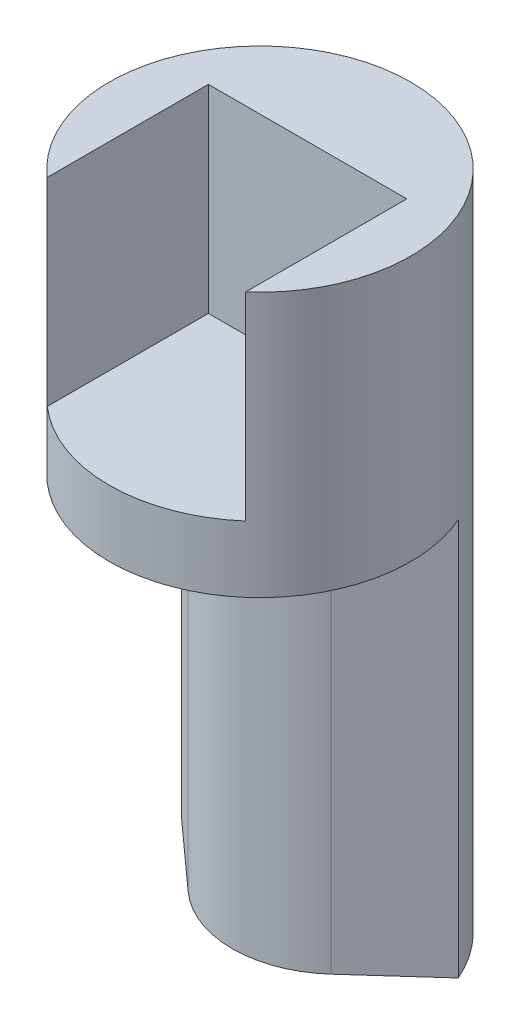
ISO-10303-21;
HEADER;
FILE_DESCRIPTION(('STEP AP214'),'2;1');
FILE_NAME('part.step','',(''),(''),'','','');
FILE_SCHEMA(('AUTOMOTIVE_DESIGN { 1 0 10303 214 1 1 1 1 }'));
ENDSEC;
DATA;
#1=APPLICATION_CONTEXT('core data for automotive mechanical design processes');
#2=APPLICATION_PROTOCOL_DEFINITION('international standard','automotive_design',2000,#1);
#3=PRODUCT_CONTEXT('',#1,'mechanical');
#4=PRODUCT('Part','Part','',(#3));
#5=PRODUCT_RELATED_PRODUCT_CATEGORY('part','',(#4));
#6=PRODUCT_DEFINITION_FORMATION('','',#4);
#7=PRODUCT_DEFINITION_CONTEXT('part definition',#1,'design');
#8=PRODUCT_DEFINITION('design','',#6,#7);
#9=PRODUCT_DEFINITION_SHAPE('','',#8);
#10=(LENGTH_UNIT() NAMED_UNIT(*) SI_UNIT(.MILLI.,.METRE.));
#11=(NAMED_UNIT(*) PLANE_ANGLE_UNIT() SI_UNIT($,.RADIAN.));
#12=(NAMED_UNIT(*) SI_UNIT($,.STERADIAN.) SOLID_ANGLE_UNIT());
#13=UNCERTAINTY_MEASURE_WITH_UNIT(LENGTH_MEASURE(1.E-05),#10,'distance_accuracy_value','');
#14=(GEOMETRIC_REPRESENTATION_CONTEXT(3) GLOBAL_UNCERTAINTY_ASSIGNED_CONTEXT((#13)) GLOBAL_UNIT_ASSIGNED_CONTEXT((#10,
#11,#12)) REPRESENTATION_CONTEXT('',''));
#15=CARTESIAN_POINT('',(0.,0.,0.));
#16=DIRECTION('',(0.,0.,1.));
#17=DIRECTION('',(1.,0.,0.));
#18=AXIS2_PLACEMENT_3D('',#15,#16,#17);
#19=CARTESIAN_POINT('',(11.8908364727638,50.8,-4.49590680157107));
#20=DIRECTION('',(0.66938331115646,0.,0.742917211232324));
#21=DIRECTION('',(0.742917211232324,0.,-0.66938331115646));
#22=AXIS2_PLACEMENT_3D('',#19,#20,#21);
#23=PLANE('',#22);
#24=DIRECTION('',(0.742917211232324,0.,-0.66938331115646));
#25=VECTOR('',#24,1.);
#26=CARTESIAN_POINT('',(3.09217667717952,38.1,3.43186218622486));
#27=LINE('',#26,#25);
#28=CARTESIAN_POINT('',(6.86894378576314,38.1,0.0289192547816858));
#29=VERTEX_POINT('',#28);
#30=CARTESIAN_POINT('',(13.2859442908798,38.1,-5.75292693327819));
#31=VERTEX_POINT('',#30);
#32=EDGE_CURVE('E141',#29,#31,#27,.T.);
#33=ORIENTED_EDGE('',*,*,#32,.F.);
#34=DIRECTION('',(0.,-1.,0.));
#35=VECTOR('',#34,1.);
#36=CARTESIAN_POINT('',(6.86894378576314,50.8,0.0289192547816858));
#37=LINE('',#36,#35);
#38=CARTESIAN_POINT('',(6.86894378576314,0.,0.0289192547816858));
#39=VERTEX_POINT('',#38);
#40=EDGE_CURVE('E162',#29,#39,#37,.T.);
#41=ORIENTED_EDGE('',*,*,#40,.T.);
#42=DIRECTION('',(-0.742917211232324,0.,0.66938331115646));
#43=VECTOR('',#42,1.);
#44=CARTESIAN_POINT('',(11.8908364727638,0.,-4.49590680157107));
#45=LINE('',#44,#43);
#46=CARTESIAN_POINT('',(13.2859442908798,0.,-5.75292693327819));
#47=VERTEX_POINT('',#46);
#48=EDGE_CURVE('E151',#47,#39,#45,.T.);
#49=ORIENTED_EDGE('',*,*,#48,.F.);
#50=DIRECTION('',(0.,-1.,0.));
#51=VECTOR('',#50,1.);
#52=CARTESIAN_POINT('',(13.2859442908798,38.1,-5.75292693327819));
#53=LINE('',#52,#51);
#54=EDGE_CURVE('E147',#31,#47,#53,.T.);
#55=ORIENTED_EDGE('',*,*,#54,.F.);
#56=EDGE_LOOP('',(#33,#41,#49,#55));
#57=FACE_BOUND('',#56,.T.);
#58=ADVANCED_FACE('F37',(#57),#23,.T.);
#59=CARTESIAN_POINT('',(0.,50.8,-7.59459999999993));
#60=DIRECTION('',(0.,-1.,0.));
#61=DIRECTION('',(0.,0.,-1.));
#62=AXIS2_PLACEMENT_3D('',#59,#60,#61);
#63=CYLINDRICAL_SURFACE('',#62,10.2616);
#64=ORIENTED_EDGE('',*,*,#40,.F.);
#65=CARTESIAN_POINT('',(0.,38.1,-7.59459999999993));
#66=DIRECTION('',(0.,1.,0.));
#67=DIRECTION('',(0.,0.,1.));
#68=AXIS2_PLACEMENT_3D('',#65,#66,#67);
#69=CIRCLE('',#68,10.2616);
#70=CARTESIAN_POINT('',(-6.86894378576314,38.1,0.0289192547816867));
#71=VERTEX_POINT('',#70);
#72=EDGE_CURVE('E137',#29,#71,#69,.F.);
#73=ORIENTED_EDGE('',*,*,#72,.T.);
#74=DIRECTION('',(0.,-1.,0.));
#75=VECTOR('',#74,1.);
#76=CARTESIAN_POINT('',(-6.86894378576314,50.8,0.0289192547816876));
#77=LINE('',#76,#75);
#78=CARTESIAN_POINT('',(-6.86894378576314,0.,0.0289192547816876));
#79=VERTEX_POINT('',#78);
#80=EDGE_CURVE('E60',#71,#79,#77,.T.);
#81=ORIENTED_EDGE('',*,*,#80,.T.);
#82=CARTESIAN_POINT('',(0.,0.,-7.59459999999993));
#83=DIRECTION('',(0.,-1.,0.));
#84=DIRECTION('',(0.,0.,1.));
#85=AXIS2_PLACEMENT_3D('',#82,#83,#84);
#86=CIRCLE('',#85,10.2616);
#87=EDGE_CURVE('E156',#39,#79,#86,.T.);
#88=ORIENTED_EDGE('',*,*,#87,.F.);
#89=EDGE_LOOP('',(#64,#73,#81,#88));
#90=FACE_BOUND('',#89,.T.);
#91=ADVANCED_FACE('F179',(#90),#63,.T.);
#92=CARTESIAN_POINT('',(-11.8908364727638,50.8,-4.49590680157107));
#93=DIRECTION('',(-0.66938331115646,0.,0.742917211232324));
#94=DIRECTION('',(0.742917211232324,0.,0.669383311156461));
#95=AXIS2_PLACEMENT_3D('',#92,#93,#94);
#96=PLANE('',#95);
#97=ORIENTED_EDGE('',*,*,#80,.F.);
#98=DIRECTION('',(-0.742917211232324,0.,-0.66938331115646));
#99=VECTOR('',#98,1.);
#100=CARTESIAN_POINT('',(-3.09217667717952,38.1,3.43186218622486));
#101=LINE('',#100,#99);
#102=CARTESIAN_POINT('',(-13.2859442908798,38.1,-5.75292693327819));
#103=VERTEX_POINT('',#102);
#104=EDGE_CURVE('E139',#71,#103,#101,.T.);
#105=ORIENTED_EDGE('',*,*,#104,.T.);
#106=DIRECTION('',(0.,-1.,0.));
#107=VECTOR('',#106,1.);
#108=CARTESIAN_POINT('',(-13.2859442908798,38.1,-5.75292693327819));
#109=LINE('',#108,#107);
#110=CARTESIAN_POINT('',(-13.2859442908798,0.,-5.75292693327819));
#111=VERTEX_POINT('',#110);
#112=EDGE_CURVE('E148',#103,#111,#109,.T.);
#113=ORIENTED_EDGE('',*,*,#112,.T.);
#114=DIRECTION('',(-0.742917211232324,0.,-0.669383311156461));
#115=VECTOR('',#114,1.);
#116=CARTESIAN_POINT('',(-11.8908364727638,0.,-4.49590680157107));
#117=LINE('',#116,#115);
#118=EDGE_CURVE('E159',#79,#111,#117,.T.);
#119=ORIENTED_EDGE('',*,*,#118,.F.);
#120=EDGE_LOOP('',(#97,#105,#113,#119));
#121=FACE_BOUND('',#120,.T.);
#122=ADVANCED_FACE('F173',(#121),#96,.T.);
#123=CARTESIAN_POINT('',(0.,0.,0.));
#124=DIRECTION('',(0.,1.,0.));
#125=DIRECTION('',(0.,0.,1.));
#126=AXIS2_PLACEMENT_3D('',#123,#124,#125);
#127=PLANE('',#126);
#128=ORIENTED_EDGE('',*,*,#118,.T.);
#129=CARTESIAN_POINT('',(0.,0.,0.));
#130=DIRECTION('',(0.,1.,0.));
#131=DIRECTION('',(0.,0.,1.));
#132=AXIS2_PLACEMENT_3D('',#129,#130,#131);
#133=CIRCLE('',#132,14.478);
#134=EDGE_CURVE('E164',#47,#111,#133,.T.);
#135=ORIENTED_EDGE('',*,*,#134,.F.);
#136=ORIENTED_EDGE('',*,*,#48,.T.);
#137=ORIENTED_EDGE('',*,*,#87,.T.);
#138=EDGE_LOOP('',(#128,#135,#136,#137));
#139=FACE_BOUND('',#138,.T.);
#140=ADVANCED_FACE('F171',(#139),#127,.F.);
#141=CARTESIAN_POINT('',(0.,50.8,0.));
#142=DIRECTION('',(0.,-1.,0.));
#143=DIRECTION('',(0.,0.,-1.));
#144=AXIS2_PLACEMENT_3D('',#141,#142,#143);
#145=CYLINDRICAL_SURFACE('',#144,14.478);
#146=CARTESIAN_POINT('',(0.,63.5,0.));
#147=DIRECTION('',(0.,1.,0.));
#148=DIRECTION('',(0.,0.,1.));
#149=AXIS2_PLACEMENT_3D('',#146,#147,#148);
#150=CIRCLE('',#149,14.478);
#151=CARTESIAN_POINT('',(9.525,63.5,10.9035250721957));
#152=VERTEX_POINT('',#151);
#153=CARTESIAN_POINT('',(-9.525,63.5,10.9035250721957));
#154=VERTEX_POINT('',#153);
#155=EDGE_CURVE('E134',#152,#154,#150,.T.);
#156=ORIENTED_EDGE('',*,*,#155,.F.);
#157=DIRECTION('',(0.,-1.,0.));
#158=VECTOR('',#157,1.);
#159=CARTESIAN_POINT('',(9.525,50.8,10.9035250721957));
#160=LINE('',#159,#158);
#161=CARTESIAN_POINT('',(9.525,44.45,10.9035250721957));
#162=VERTEX_POINT('',#161);
#163=EDGE_CURVE('E132',#152,#162,#160,.T.);
#164=ORIENTED_EDGE('',*,*,#163,.T.);
#165=CARTESIAN_POINT('',(0.,44.45,0.));
#166=DIRECTION('',(0.,-1.,0.));
#167=DIRECTION('',(0.,0.,-1.));
#168=AXIS2_PLACEMENT_3D('',#165,#166,#167);
#169=CIRCLE('',#168,14.478);
#170=CARTESIAN_POINT('',(-9.525,44.45,10.9035250721957));
#171=VERTEX_POINT('',#170);
#172=EDGE_CURVE('E11',#162,#171,#169,.T.);
#173=ORIENTED_EDGE('',*,*,#172,.T.);
#174=DIRECTION('',(0.,-1.,0.));
#175=VECTOR('',#174,1.);
#176=CARTESIAN_POINT('',(-9.525,50.8,10.9035250721957));
#177=LINE('',#176,#175);
#178=EDGE_CURVE('E128',#171,#154,#177,.F.);
#179=ORIENTED_EDGE('',*,*,#178,.T.);
#180=EDGE_LOOP('',(#156,#164,#173,#179));
#181=FACE_BOUND('',#180,.T.);
#182=CARTESIAN_POINT('',(0.,38.1,0.));
#183=DIRECTION('',(0.,-1.,0.));
#184=DIRECTION('',(0.,0.,-1.));
#185=AXIS2_PLACEMENT_3D('',#182,#183,#184);
#186=CIRCLE('',#185,14.478);
#187=EDGE_CURVE('E144',#31,#103,#186,.T.);
#188=ORIENTED_EDGE('',*,*,#187,.F.);
#189=ORIENTED_EDGE('',*,*,#54,.T.);
#190=ORIENTED_EDGE('',*,*,#134,.T.);
#191=ORIENTED_EDGE('',*,*,#112,.F.);
#192=EDGE_LOOP('',(#188,#189,#190,#191));
#193=FACE_BOUND('',#192,.T.);
#194=ADVANCED_FACE('F39',(#181,#193),#145,.T.);
#195=CARTESIAN_POINT('',(0.,38.1,0.));
#196=DIRECTION('',(0.,-1.,0.));
#197=DIRECTION('',(0.,0.,-1.));
#198=AXIS2_PLACEMENT_3D('',#195,#196,#197);
#199=PLANE('',#198);
#200=ORIENTED_EDGE('',*,*,#104,.F.);
#201=ORIENTED_EDGE('',*,*,#72,.F.);
#202=ORIENTED_EDGE('',*,*,#32,.T.);
#203=ORIENTED_EDGE('',*,*,#187,.T.);
#204=EDGE_LOOP('',(#200,#201,#202,#203));
#205=FACE_BOUND('',#204,.T.);
#206=ADVANCED_FACE('F176',(#205),#199,.T.);
#207=CARTESIAN_POINT('',(0.,63.5,0.));
#208=DIRECTION('',(0.,1.,0.));
#209=DIRECTION('',(0.,0.,1.));
#210=AXIS2_PLACEMENT_3D('',#207,#208,#209);
#211=PLANE('',#210);
#212=DIRECTION('',(0.,0.,-1.));
#213=VECTOR('',#212,1.);
#214=CARTESIAN_POINT('',(9.525,63.5,0.));
#215=LINE('',#214,#213);
#216=CARTESIAN_POINT('',(9.525,63.5,-4.572));
#217=VERTEX_POINT('',#216);
#218=EDGE_CURVE('E45',#152,#217,#215,.T.);
#219=ORIENTED_EDGE('',*,*,#218,.F.);
#220=ORIENTED_EDGE('',*,*,#155,.T.);
#221=DIRECTION('',(0.,0.,1.));
#222=VECTOR('',#221,1.);
#223=CARTESIAN_POINT('',(-9.525,63.5,14.478));
#224=LINE('',#223,#222);
#225=CARTESIAN_POINT('',(-9.525,63.5,-4.572));
#226=VERTEX_POINT('',#225);
#227=EDGE_CURVE('E112',#226,#154,#224,.T.);
#228=ORIENTED_EDGE('',*,*,#227,.F.);
#229=DIRECTION('',(-1.,0.,0.));
#230=VECTOR('',#229,1.);
#231=CARTESIAN_POINT('',(-9.525,63.5,-4.572));
#232=LINE('',#231,#230);
#233=EDGE_CURVE('E125',#217,#226,#232,.T.);
#234=ORIENTED_EDGE('',*,*,#233,.F.);
#235=EDGE_LOOP('',(#219,#220,#228,#234));
#236=FACE_BOUND('',#235,.T.);
#237=ADVANCED_FACE('F197',(#236),#211,.T.);
#238=CARTESIAN_POINT('',(0.,44.45,0.));
#239=DIRECTION('',(0.,-1.,0.));
#240=DIRECTION('',(0.,0.,-1.));
#241=AXIS2_PLACEMENT_3D('',#238,#239,#240);
#242=PLANE('',#241);
#243=DIRECTION('',(0.,0.,-1.));
#244=VECTOR('',#243,1.);
#245=CARTESIAN_POINT('',(9.525,44.45,14.478));
#246=LINE('',#245,#244);
#247=CARTESIAN_POINT('',(9.525,44.45,-4.572));
#248=VERTEX_POINT('',#247);
#249=EDGE_CURVE('E106',#162,#248,#246,.T.);
#250=ORIENTED_EDGE('',*,*,#249,.T.);
#251=DIRECTION('',(-1.,0.,0.));
#252=VECTOR('',#251,1.);
#253=CARTESIAN_POINT('',(-9.525,44.45,-4.572));
#254=LINE('',#253,#252);
#255=CARTESIAN_POINT('',(-9.525,44.45,-4.572));
#256=VERTEX_POINT('',#255);
#257=EDGE_CURVE('E109',#248,#256,#254,.T.);
#258=ORIENTED_EDGE('',*,*,#257,.T.);
#259=DIRECTION('',(0.,0.,1.));
#260=VECTOR('',#259,1.);
#261=CARTESIAN_POINT('',(-9.525,44.45,14.478));
#262=LINE('',#261,#260);
#263=EDGE_CURVE('E118',#256,#171,#262,.T.);
#264=ORIENTED_EDGE('',*,*,#263,.T.);
#265=ORIENTED_EDGE('',*,*,#172,.F.);
#266=EDGE_LOOP('',(#250,#258,#264,#265));
#267=FACE_BOUND('',#266,.T.);
#268=ADVANCED_FACE('F107',(#267),#242,.F.);
#269=CARTESIAN_POINT('',(9.525,44.45,14.478));
#270=DIRECTION('',(1.,0.,0.));
#271=DIRECTION('',(0.,0.,-1.));
#272=AXIS2_PLACEMENT_3D('',#269,#270,#271);
#273=PLANE('',#272);
#274=ORIENTED_EDGE('',*,*,#218,.T.);
#275=DIRECTION('',(0.,1.,0.));
#276=VECTOR('',#275,1.);
#277=CARTESIAN_POINT('',(9.525,44.45,-4.572));
#278=LINE('',#277,#276);
#279=EDGE_CURVE('E52',#248,#217,#278,.T.);
#280=ORIENTED_EDGE('',*,*,#279,.F.);
#281=ORIENTED_EDGE('',*,*,#249,.F.);
#282=ORIENTED_EDGE('',*,*,#163,.F.);
#283=EDGE_LOOP('',(#274,#280,#281,#282));
#284=FACE_BOUND('',#283,.T.);
#285=ADVANCED_FACE('F114',(#284),#273,.F.);
#286=CARTESIAN_POINT('',(-9.525,44.45,14.478));
#287=DIRECTION('',(-1.,0.,0.));
#288=DIRECTION('',(0.,0.,1.));
#289=AXIS2_PLACEMENT_3D('',#286,#287,#288);
#290=PLANE('',#289);
#291=ORIENTED_EDGE('',*,*,#263,.F.);
#292=DIRECTION('',(0.,1.,0.));
#293=VECTOR('',#292,1.);
#294=CARTESIAN_POINT('',(-9.525,44.45,-4.572));
#295=LINE('',#294,#293);
#296=EDGE_CURVE('E117',#256,#226,#295,.T.);
#297=ORIENTED_EDGE('',*,*,#296,.T.);
#298=ORIENTED_EDGE('',*,*,#227,.T.);
#299=ORIENTED_EDGE('',*,*,#178,.F.);
#300=EDGE_LOOP('',(#291,#297,#298,#299));
#301=FACE_BOUND('',#300,.T.);
#302=ADVANCED_FACE('F202',(#301),#290,.F.);
#303=CARTESIAN_POINT('',(-9.525,44.45,-4.572));
#304=DIRECTION('',(0.,0.,-1.));
#305=DIRECTION('',(-1.,0.,0.));
#306=AXIS2_PLACEMENT_3D('',#303,#304,#305);
#307=PLANE('',#306);
#308=ORIENTED_EDGE('',*,*,#233,.T.);
#309=ORIENTED_EDGE('',*,*,#296,.F.);
#310=ORIENTED_EDGE('',*,*,#257,.F.);
#311=ORIENTED_EDGE('',*,*,#279,.T.);
#312=EDGE_LOOP('',(#308,#309,#310,#311));
#313=FACE_BOUND('',#312,.T.);
#314=ADVANCED_FACE('F120',(#313),#307,.F.);
#315=CLOSED_SHELL('',(#58,#91,#122,#140,#194,#206,#237,#268,#285,#302,#314));
#316=MANIFOLD_SOLID_BREP('B2',#315);
#317=ADVANCED_BREP_SHAPE_REPRESENTATION('',(#18,#316),#14);
#318=SHAPE_DEFINITION_REPRESENTATION(#9,#317);
ENDSEC;
END-ISO-10303-21;
